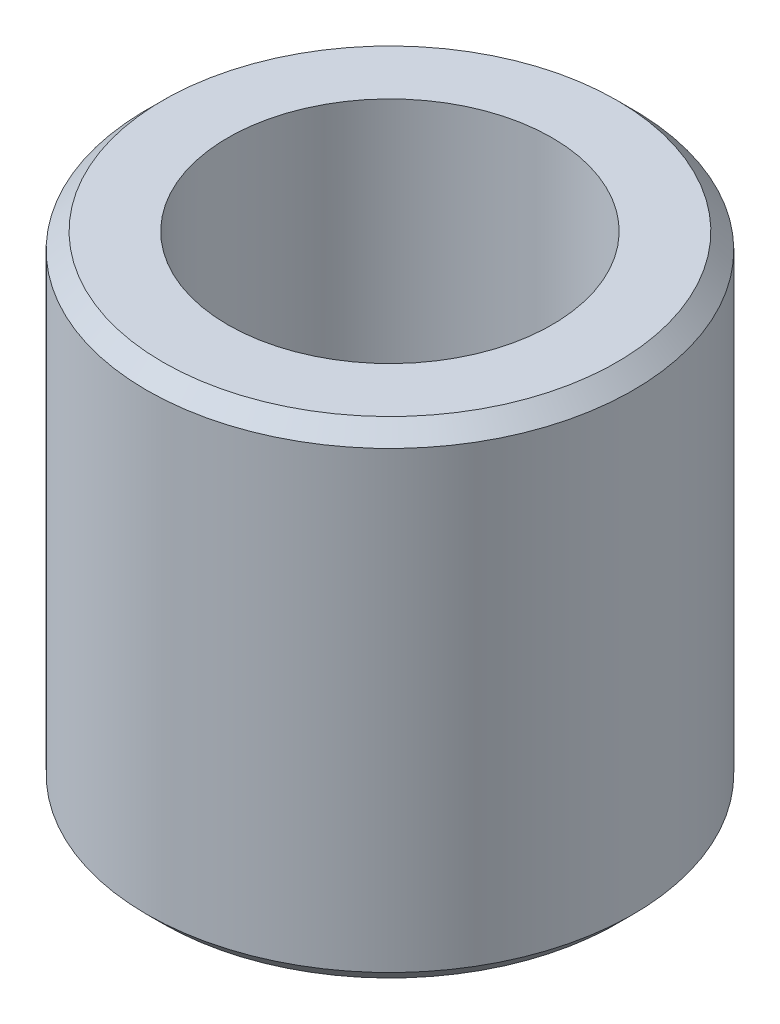
ISO-10303-21;
HEADER;
FILE_DESCRIPTION(('STEP AP214'),'2;1');
FILE_NAME('part.step','',(''),(''),'','','');
FILE_SCHEMA(('AUTOMOTIVE_DESIGN { 1 0 10303 214 1 1 1 1 }'));
ENDSEC;
DATA;
#1=APPLICATION_CONTEXT('core data for automotive mechanical design processes');
#2=APPLICATION_PROTOCOL_DEFINITION('international standard','automotive_design',2000,#1);
#3=PRODUCT_CONTEXT('',#1,'mechanical');
#4=PRODUCT('Part','Part','',(#3));
#5=PRODUCT_RELATED_PRODUCT_CATEGORY('part','',(#4));
#6=PRODUCT_DEFINITION_FORMATION('','',#4);
#7=PRODUCT_DEFINITION_CONTEXT('part definition',#1,'design');
#8=PRODUCT_DEFINITION('design','',#6,#7);
#9=PRODUCT_DEFINITION_SHAPE('','',#8);
#10=(LENGTH_UNIT() NAMED_UNIT(*) SI_UNIT(.MILLI.,.METRE.));
#11=(NAMED_UNIT(*) PLANE_ANGLE_UNIT() SI_UNIT($,.RADIAN.));
#12=(NAMED_UNIT(*) SI_UNIT($,.STERADIAN.) SOLID_ANGLE_UNIT());
#13=UNCERTAINTY_MEASURE_WITH_UNIT(LENGTH_MEASURE(1.E-05),#10,'distance_accuracy_value','');
#14=(GEOMETRIC_REPRESENTATION_CONTEXT(3) GLOBAL_UNCERTAINTY_ASSIGNED_CONTEXT((#13)) GLOBAL_UNIT_ASSIGNED_CONTEXT((#10,
#11,#12)) REPRESENTATION_CONTEXT('',''));
#15=CARTESIAN_POINT('',(0.,0.,0.));
#16=DIRECTION('',(0.,0.,1.));
#17=DIRECTION('',(1.,0.,0.));
#18=AXIS2_PLACEMENT_3D('',#15,#16,#17);
#19=CARTESIAN_POINT('',(0.,15.,0.));
#20=DIRECTION('',(0.,-1.,0.));
#21=DIRECTION('',(0.,0.,-1.));
#22=AXIS2_PLACEMENT_3D('',#19,#20,#21);
#23=CYLINDRICAL_SURFACE('',#22,15.);
#24=CARTESIAN_POINT('',(0.,-14.,0.));
#25=DIRECTION('',(0.,1.,0.));
#26=DIRECTION('',(0.,0.,1.));
#27=AXIS2_PLACEMENT_3D('',#24,#25,#26);
#28=CIRCLE('',#27,15.);
#29=CARTESIAN_POINT('',(0.,-14.,15.));
#30=VERTEX_POINT('',#29);
#31=EDGE_CURVE('E59',#30,#30,#28,.T.);
#32=ORIENTED_EDGE('',*,*,#31,.T.);
#33=EDGE_LOOP('',(#32));
#34=FACE_BOUND('',#33,.T.);
#35=CARTESIAN_POINT('',(0.,14.,0.));
#36=DIRECTION('',(0.,1.,0.));
#37=DIRECTION('',(0.,0.,1.));
#38=AXIS2_PLACEMENT_3D('',#35,#36,#37);
#39=CIRCLE('',#38,15.);
#40=CARTESIAN_POINT('',(0.,14.,15.));
#41=VERTEX_POINT('',#40);
#42=EDGE_CURVE('E64',#41,#41,#39,.F.);
#43=ORIENTED_EDGE('',*,*,#42,.T.);
#44=EDGE_LOOP('',(#43));
#45=FACE_BOUND('',#44,.T.);
#46=ADVANCED_FACE('F45',(#34,#45),#23,.T.);
#47=CARTESIAN_POINT('',(0.,15.,0.));
#48=DIRECTION('',(0.,1.,0.));
#49=DIRECTION('',(0.,0.,1.));
#50=AXIS2_PLACEMENT_3D('',#47,#48,#49);
#51=PLANE('',#50);
#52=CARTESIAN_POINT('',(0.,15.,0.));
#53=DIRECTION('',(0.,1.,0.));
#54=DIRECTION('',(0.,0.,1.));
#55=AXIS2_PLACEMENT_3D('',#52,#53,#54);
#56=CIRCLE('',#55,14.);
#57=CARTESIAN_POINT('',(0.,15.,14.));
#58=VERTEX_POINT('',#57);
#59=EDGE_CURVE('E10',#58,#58,#56,.T.);
#60=ORIENTED_EDGE('',*,*,#59,.T.);
#61=EDGE_LOOP('',(#60));
#62=FACE_BOUND('',#61,.T.);
#63=CARTESIAN_POINT('',(0.,15.,0.));
#64=DIRECTION('',(0.,1.,0.));
#65=DIRECTION('',(0.,0.,1.));
#66=AXIS2_PLACEMENT_3D('',#63,#64,#65);
#67=CIRCLE('',#66,10.);
#68=CARTESIAN_POINT('',(0.,15.,10.));
#69=VERTEX_POINT('',#68);
#70=EDGE_CURVE('E70',#69,#69,#67,.T.);
#71=ORIENTED_EDGE('',*,*,#70,.F.);
#72=EDGE_LOOP('',(#71));
#73=FACE_BOUND('',#72,.T.);
#74=ADVANCED_FACE('F83',(#62,#73),#51,.T.);
#75=CARTESIAN_POINT('',(0.,-15.,0.));
#76=DIRECTION('',(0.,1.,0.));
#77=DIRECTION('',(0.,0.,1.));
#78=AXIS2_PLACEMENT_3D('',#75,#76,#77);
#79=PLANE('',#78);
#80=CARTESIAN_POINT('',(0.,-15.,0.));
#81=DIRECTION('',(0.,1.,0.));
#82=DIRECTION('',(0.,0.,1.));
#83=AXIS2_PLACEMENT_3D('',#80,#81,#82);
#84=CIRCLE('',#83,14.);
#85=CARTESIAN_POINT('',(0.,-15.,14.));
#86=VERTEX_POINT('',#85);
#87=EDGE_CURVE('E54',#86,#86,#84,.F.);
#88=ORIENTED_EDGE('',*,*,#87,.T.);
#89=EDGE_LOOP('',(#88));
#90=FACE_BOUND('',#89,.T.);
#91=CARTESIAN_POINT('',(0.,-15.,0.));
#92=DIRECTION('',(0.,-1.,0.));
#93=DIRECTION('',(0.,0.,-1.));
#94=AXIS2_PLACEMENT_3D('',#91,#92,#93);
#95=CIRCLE('',#94,10.);
#96=CARTESIAN_POINT('',(0.,-15.,-10.));
#97=VERTEX_POINT('',#96);
#98=EDGE_CURVE('E74',#97,#97,#95,.T.);
#99=ORIENTED_EDGE('',*,*,#98,.F.);
#100=EDGE_LOOP('',(#99));
#101=FACE_BOUND('',#100,.T.);
#102=ADVANCED_FACE('F81',(#90,#101),#79,.F.);
#103=CARTESIAN_POINT('',(0.,21.,0.));
#104=DIRECTION('',(0.,-1.,0.));
#105=DIRECTION('',(0.,0.,-1.));
#106=AXIS2_PLACEMENT_3D('',#103,#104,#105);
#107=CYLINDRICAL_SURFACE('',#106,10.);
#108=ORIENTED_EDGE('',*,*,#70,.T.);
#109=EDGE_LOOP('',(#108));
#110=FACE_BOUND('',#109,.T.);
#111=ORIENTED_EDGE('',*,*,#98,.T.);
#112=EDGE_LOOP('',(#111));
#113=FACE_BOUND('',#112,.T.);
#114=ADVANCED_FACE('F79',(#110,#113),#107,.F.);
#115=CARTESIAN_POINT('',(0.,-14.,0.));
#116=DIRECTION('',(0.,1.,0.));
#117=DIRECTION('',(0.,0.,1.));
#118=AXIS2_PLACEMENT_3D('',#115,#116,#117);
#119=CONICAL_SURFACE('',#118,15.,0.785398163397449);
#120=ORIENTED_EDGE('',*,*,#87,.F.);
#121=EDGE_LOOP('',(#120));
#122=FACE_BOUND('',#121,.T.);
#123=ORIENTED_EDGE('',*,*,#31,.F.);
#124=EDGE_LOOP('',(#123));
#125=FACE_BOUND('',#124,.T.);
#126=ADVANCED_FACE('F90',(#122,#125),#119,.T.);
#127=CARTESIAN_POINT('',(0.,15.,0.));
#128=DIRECTION('',(0.,-1.,0.));
#129=DIRECTION('',(0.,0.,-1.));
#130=AXIS2_PLACEMENT_3D('',#127,#128,#129);
#131=CONICAL_SURFACE('',#130,14.,0.785398163397447);
#132=ORIENTED_EDGE('',*,*,#42,.F.);
#133=EDGE_LOOP('',(#132));
#134=FACE_BOUND('',#133,.T.);
#135=ORIENTED_EDGE('',*,*,#59,.F.);
#136=EDGE_LOOP('',(#135));
#137=FACE_BOUND('',#136,.T.);
#138=ADVANCED_FACE('F48',(#134,#137),#131,.T.);
#139=CLOSED_SHELL('',(#46,#74,#102,#114,#126,#138));
#140=MANIFOLD_SOLID_BREP('B2',#139);
#141=ADVANCED_BREP_SHAPE_REPRESENTATION('',(#18,#140),#14);
#142=SHAPE_DEFINITION_REPRESENTATION(#9,#141);
ENDSEC;
END-ISO-10303-21;
